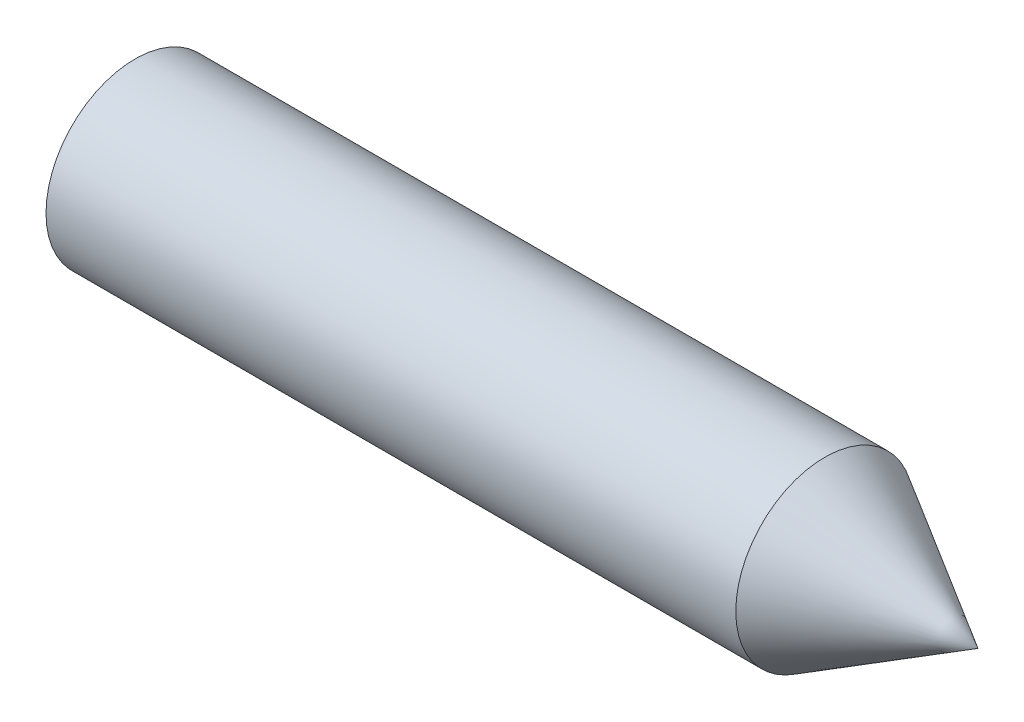
ISO-10303-21;
HEADER;
FILE_DESCRIPTION(('STEP AP214'),'2;1');
FILE_NAME('part.step','',(''),(''),'','','');
FILE_SCHEMA(('AUTOMOTIVE_DESIGN { 1 0 10303 214 1 1 1 1 }'));
ENDSEC;
DATA;
#1=APPLICATION_CONTEXT('core data for automotive mechanical design processes');
#2=APPLICATION_PROTOCOL_DEFINITION('international standard','automotive_design',2000,#1);
#3=PRODUCT_CONTEXT('',#1,'mechanical');
#4=PRODUCT('Part','Part','',(#3));
#5=PRODUCT_RELATED_PRODUCT_CATEGORY('part','',(#4));
#6=PRODUCT_DEFINITION_FORMATION('','',#4);
#7=PRODUCT_DEFINITION_CONTEXT('part definition',#1,'design');
#8=PRODUCT_DEFINITION('design','',#6,#7);
#9=PRODUCT_DEFINITION_SHAPE('','',#8);
#10=(LENGTH_UNIT() NAMED_UNIT(*) SI_UNIT(.MILLI.,.METRE.));
#11=(NAMED_UNIT(*) PLANE_ANGLE_UNIT() SI_UNIT($,.RADIAN.));
#12=(NAMED_UNIT(*) SI_UNIT($,.STERADIAN.) SOLID_ANGLE_UNIT());
#13=UNCERTAINTY_MEASURE_WITH_UNIT(LENGTH_MEASURE(1.E-05),#10,'distance_accuracy_value','');
#14=(GEOMETRIC_REPRESENTATION_CONTEXT(3) GLOBAL_UNCERTAINTY_ASSIGNED_CONTEXT((#13)) GLOBAL_UNIT_ASSIGNED_CONTEXT((#10,
#11,#12)) REPRESENTATION_CONTEXT('',''));
#15=CARTESIAN_POINT('',(0.,0.,0.));
#16=DIRECTION('',(0.,0.,1.));
#17=DIRECTION('',(1.,0.,0.));
#18=AXIS2_PLACEMENT_3D('',#15,#16,#17);
#19=CARTESIAN_POINT('',(0.,3.302,0.));
#20=DIRECTION('',(1.,0.,0.));
#21=DIRECTION('',(0.,0.,-1.));
#22=AXIS2_PLACEMENT_3D('',#19,#20,#21);
#23=PLANE('',#22);
#24=CARTESIAN_POINT('',(0.,0.,0.));
#25=DIRECTION('',(-1.,0.,0.));
#26=DIRECTION('',(0.,0.,1.));
#27=AXIS2_PLACEMENT_3D('',#24,#25,#26);
#28=CIRCLE('',#27,3.302);
#29=CARTESIAN_POINT('',(0.,0.,3.302));
#30=VERTEX_POINT('',#29);
#31=EDGE_CURVE('E11',#30,#30,#28,.T.);
#32=ORIENTED_EDGE('',*,*,#31,.T.);
#33=EDGE_LOOP('',(#32));
#34=FACE_BOUND('',#33,.T.);
#35=ADVANCED_FACE('F34',(#34),#23,.F.);
#36=CARTESIAN_POINT('',(0.,0.,0.));
#37=DIRECTION('',(-1.,0.,0.));
#38=DIRECTION('',(0.,0.,1.));
#39=AXIS2_PLACEMENT_3D('',#36,#37,#38);
#40=CYLINDRICAL_SURFACE('',#39,3.302);
#41=ORIENTED_EDGE('',*,*,#31,.F.);
#42=EDGE_LOOP('',(#41));
#43=FACE_BOUND('',#42,.T.);
#44=CARTESIAN_POINT('',(25.5663176450176,0.,0.));
#45=DIRECTION('',(-1.,0.,0.));
#46=DIRECTION('',(0.,0.,1.));
#47=AXIS2_PLACEMENT_3D('',#44,#45,#46);
#48=CIRCLE('',#47,3.302);
#49=CARTESIAN_POINT('',(25.5663176450176,0.,3.302));
#50=VERTEX_POINT('',#49);
#51=EDGE_CURVE('E40',#50,#50,#48,.T.);
#52=ORIENTED_EDGE('',*,*,#51,.T.);
#53=EDGE_LOOP('',(#52));
#54=FACE_BOUND('',#53,.T.);
#55=ADVANCED_FACE('F45',(#43,#54),#40,.T.);
#56=CARTESIAN_POINT('',(31.242,0.,0.));
#57=DIRECTION('',(-1.,0.,0.));
#58=DIRECTION('',(0.,0.,1.));
#59=AXIS2_PLACEMENT_3D('',#56,#57,#58);
#60=CONICAL_SURFACE('',#59,0.,0.526914901177082);
#61=ORIENTED_EDGE('',*,*,#51,.F.);
#62=EDGE_LOOP('',(#61));
#63=FACE_BOUND('',#62,.T.);
#64=CARTESIAN_POINT('',(31.242,0.,0.));
#65=VERTEX_POINT('',#64);
#66=VERTEX_LOOP('',#65);
#67=FACE_BOUND('',#66,.T.);
#68=ADVANCED_FACE('F43',(#63,#67),#60,.T.);
#69=CLOSED_SHELL('',(#35,#55,#68));
#70=MANIFOLD_SOLID_BREP('B2',#69);
#71=ADVANCED_BREP_SHAPE_REPRESENTATION('',(#18,#70),#14);
#72=SHAPE_DEFINITION_REPRESENTATION(#9,#71);
ENDSEC;
END-ISO-10303-21;
